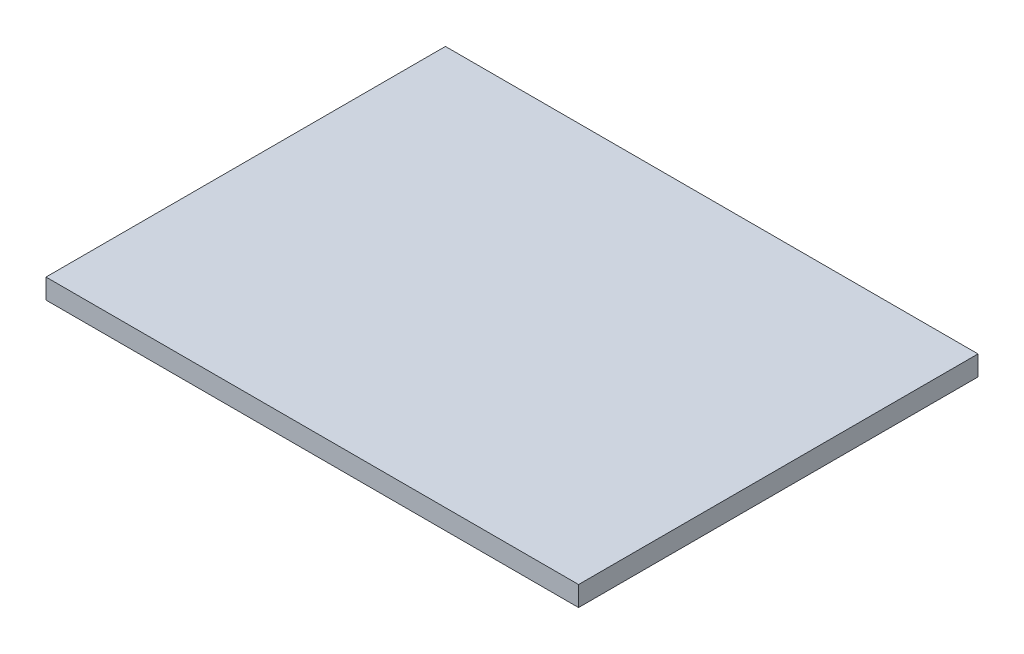
ISO-10303-21;
HEADER;
FILE_DESCRIPTION(('STEP AP214'),'2;1');
FILE_NAME('part.step','',(''),(''),'','','');
FILE_SCHEMA(('AUTOMOTIVE_DESIGN { 1 0 10303 214 1 1 1 1 }'));
ENDSEC;
DATA;
#1=APPLICATION_CONTEXT('core data for automotive mechanical design processes');
#2=APPLICATION_PROTOCOL_DEFINITION('international standard','automotive_design',2000,#1);
#3=PRODUCT_CONTEXT('',#1,'mechanical');
#4=PRODUCT('Part','Part','',(#3));
#5=PRODUCT_RELATED_PRODUCT_CATEGORY('part','',(#4));
#6=PRODUCT_DEFINITION_FORMATION('','',#4);
#7=PRODUCT_DEFINITION_CONTEXT('part definition',#1,'design');
#8=PRODUCT_DEFINITION('design','',#6,#7);
#9=PRODUCT_DEFINITION_SHAPE('','',#8);
#10=(LENGTH_UNIT() NAMED_UNIT(*) SI_UNIT(.MILLI.,.METRE.));
#11=(NAMED_UNIT(*) PLANE_ANGLE_UNIT() SI_UNIT($,.RADIAN.));
#12=(NAMED_UNIT(*) SI_UNIT($,.STERADIAN.) SOLID_ANGLE_UNIT());
#13=UNCERTAINTY_MEASURE_WITH_UNIT(LENGTH_MEASURE(1.E-05),#10,'distance_accuracy_value','');
#14=(GEOMETRIC_REPRESENTATION_CONTEXT(3) GLOBAL_UNCERTAINTY_ASSIGNED_CONTEXT((#13)) GLOBAL_UNIT_ASSIGNED_CONTEXT((#10,
#11,#12)) REPRESENTATION_CONTEXT('',''));
#15=CARTESIAN_POINT('',(0.,0.,0.));
#16=DIRECTION('',(0.,0.,1.));
#17=DIRECTION('',(1.,0.,0.));
#18=AXIS2_PLACEMENT_3D('',#15,#16,#17);
#19=CARTESIAN_POINT('',(40.,3.,-30.));
#20=DIRECTION('',(-1.,0.,0.));
#21=DIRECTION('',(0.,0.,1.));
#22=AXIS2_PLACEMENT_3D('',#19,#20,#21);
#23=PLANE('',#22);
#24=DIRECTION('',(0.,0.,-1.));
#25=VECTOR('',#24,1.);
#26=CARTESIAN_POINT('',(40.,0.,-30.));
#27=LINE('',#26,#25);
#28=CARTESIAN_POINT('',(40.,0.,30.));
#29=VERTEX_POINT('',#28);
#30=CARTESIAN_POINT('',(40.,0.,-30.));
#31=VERTEX_POINT('',#30);
#32=EDGE_CURVE('E107',#29,#31,#27,.T.);
#33=ORIENTED_EDGE('',*,*,#32,.T.);
#34=DIRECTION('',(0.,-1.,0.));
#35=VECTOR('',#34,1.);
#36=CARTESIAN_POINT('',(40.,3.,-30.));
#37=LINE('',#36,#35);
#38=CARTESIAN_POINT('',(40.,3.,-30.));
#39=VERTEX_POINT('',#38);
#40=EDGE_CURVE('E11',#39,#31,#37,.T.);
#41=ORIENTED_EDGE('',*,*,#40,.F.);
#42=DIRECTION('',(0.,0.,-1.));
#43=VECTOR('',#42,1.);
#44=CARTESIAN_POINT('',(40.,3.,-30.));
#45=LINE('',#44,#43);
#46=CARTESIAN_POINT('',(40.,3.,30.));
#47=VERTEX_POINT('',#46);
#48=EDGE_CURVE('E91',#47,#39,#45,.T.);
#49=ORIENTED_EDGE('',*,*,#48,.F.);
#50=DIRECTION('',(0.,-1.,0.));
#51=VECTOR('',#50,1.);
#52=CARTESIAN_POINT('',(40.,3.,30.));
#53=LINE('',#52,#51);
#54=EDGE_CURVE('E103',#47,#29,#53,.T.);
#55=ORIENTED_EDGE('',*,*,#54,.T.);
#56=EDGE_LOOP('',(#33,#41,#49,#55));
#57=FACE_BOUND('',#56,.T.);
#58=ADVANCED_FACE('F39',(#57),#23,.F.);
#59=CARTESIAN_POINT('',(-40.,3.,-30.));
#60=DIRECTION('',(0.,0.,1.));
#61=DIRECTION('',(1.,0.,0.));
#62=AXIS2_PLACEMENT_3D('',#59,#60,#61);
#63=PLANE('',#62);
#64=DIRECTION('',(-1.,0.,0.));
#65=VECTOR('',#64,1.);
#66=CARTESIAN_POINT('',(-40.,0.,-30.));
#67=LINE('',#66,#65);
#68=CARTESIAN_POINT('',(-40.,0.,-30.));
#69=VERTEX_POINT('',#68);
#70=EDGE_CURVE('E96',#31,#69,#67,.T.);
#71=ORIENTED_EDGE('',*,*,#70,.T.);
#72=DIRECTION('',(0.,-1.,0.));
#73=VECTOR('',#72,1.);
#74=CARTESIAN_POINT('',(-40.,3.,-30.));
#75=LINE('',#74,#73);
#76=CARTESIAN_POINT('',(-40.,3.,-30.));
#77=VERTEX_POINT('',#76);
#78=EDGE_CURVE('E48',#77,#69,#75,.T.);
#79=ORIENTED_EDGE('',*,*,#78,.F.);
#80=DIRECTION('',(-1.,0.,0.));
#81=VECTOR('',#80,1.);
#82=CARTESIAN_POINT('',(-40.,3.,-30.));
#83=LINE('',#82,#81);
#84=EDGE_CURVE('E86',#39,#77,#83,.T.);
#85=ORIENTED_EDGE('',*,*,#84,.F.);
#86=ORIENTED_EDGE('',*,*,#40,.T.);
#87=EDGE_LOOP('',(#71,#79,#85,#86));
#88=FACE_BOUND('',#87,.T.);
#89=ADVANCED_FACE('F95',(#88),#63,.F.);
#90=CARTESIAN_POINT('',(-40.,3.,-30.));
#91=DIRECTION('',(1.,0.,0.));
#92=DIRECTION('',(0.,0.,-1.));
#93=AXIS2_PLACEMENT_3D('',#90,#91,#92);
#94=PLANE('',#93);
#95=DIRECTION('',(0.,0.,1.));
#96=VECTOR('',#95,1.);
#97=CARTESIAN_POINT('',(-40.,0.,-30.));
#98=LINE('',#97,#96);
#99=CARTESIAN_POINT('',(-40.,0.,30.));
#100=VERTEX_POINT('',#99);
#101=EDGE_CURVE('E73',#69,#100,#98,.T.);
#102=ORIENTED_EDGE('',*,*,#101,.T.);
#103=DIRECTION('',(0.,-1.,0.));
#104=VECTOR('',#103,1.);
#105=CARTESIAN_POINT('',(-40.,3.,30.));
#106=LINE('',#105,#104);
#107=CARTESIAN_POINT('',(-40.,3.,30.));
#108=VERTEX_POINT('',#107);
#109=EDGE_CURVE('E98',#108,#100,#106,.T.);
#110=ORIENTED_EDGE('',*,*,#109,.F.);
#111=DIRECTION('',(0.,0.,1.));
#112=VECTOR('',#111,1.);
#113=CARTESIAN_POINT('',(-40.,3.,-30.));
#114=LINE('',#113,#112);
#115=EDGE_CURVE('E89',#77,#108,#114,.T.);
#116=ORIENTED_EDGE('',*,*,#115,.F.);
#117=ORIENTED_EDGE('',*,*,#78,.T.);
#118=EDGE_LOOP('',(#102,#110,#116,#117));
#119=FACE_BOUND('',#118,.T.);
#120=ADVANCED_FACE('F99',(#119),#94,.F.);
#121=CARTESIAN_POINT('',(-40.,3.,30.));
#122=DIRECTION('',(0.,0.,-1.));
#123=DIRECTION('',(-1.,0.,0.));
#124=AXIS2_PLACEMENT_3D('',#121,#122,#123);
#125=PLANE('',#124);
#126=DIRECTION('',(1.,0.,0.));
#127=VECTOR('',#126,1.);
#128=CARTESIAN_POINT('',(-40.,0.,30.));
#129=LINE('',#128,#127);
#130=EDGE_CURVE('E79',#100,#29,#129,.T.);
#131=ORIENTED_EDGE('',*,*,#130,.T.);
#132=ORIENTED_EDGE('',*,*,#54,.F.);
#133=DIRECTION('',(1.,0.,0.));
#134=VECTOR('',#133,1.);
#135=CARTESIAN_POINT('',(-40.,3.,30.));
#136=LINE('',#135,#134);
#137=EDGE_CURVE('E56',#108,#47,#136,.T.);
#138=ORIENTED_EDGE('',*,*,#137,.F.);
#139=ORIENTED_EDGE('',*,*,#109,.T.);
#140=EDGE_LOOP('',(#131,#132,#138,#139));
#141=FACE_BOUND('',#140,.T.);
#142=ADVANCED_FACE('F120',(#141),#125,.F.);
#143=CARTESIAN_POINT('',(0.,3.,0.));
#144=DIRECTION('',(0.,1.,0.));
#145=DIRECTION('',(0.,0.,1.));
#146=AXIS2_PLACEMENT_3D('',#143,#144,#145);
#147=PLANE('',#146);
#148=ORIENTED_EDGE('',*,*,#48,.T.);
#149=ORIENTED_EDGE('',*,*,#84,.T.);
#150=ORIENTED_EDGE('',*,*,#115,.T.);
#151=ORIENTED_EDGE('',*,*,#137,.T.);
#152=EDGE_LOOP('',(#148,#149,#150,#151));
#153=FACE_BOUND('',#152,.T.);
#154=ADVANCED_FACE('F87',(#153),#147,.T.);
#155=CARTESIAN_POINT('',(0.,0.,0.));
#156=DIRECTION('',(0.,1.,0.));
#157=DIRECTION('',(0.,0.,1.));
#158=AXIS2_PLACEMENT_3D('',#155,#156,#157);
#159=PLANE('',#158);
#160=ORIENTED_EDGE('',*,*,#32,.F.);
#161=ORIENTED_EDGE('',*,*,#130,.F.);
#162=ORIENTED_EDGE('',*,*,#101,.F.);
#163=ORIENTED_EDGE('',*,*,#70,.F.);
#164=EDGE_LOOP('',(#160,#161,#162,#163));
#165=FACE_BOUND('',#164,.T.);
#166=ADVANCED_FACE('F123',(#165),#159,.F.);
#167=CLOSED_SHELL('',(#58,#89,#120,#142,#154,#166));
#168=MANIFOLD_SOLID_BREP('B2',#167);
#169=ADVANCED_BREP_SHAPE_REPRESENTATION('',(#18,#168),#14);
#170=SHAPE_DEFINITION_REPRESENTATION(#9,#169);
ENDSEC;
END-ISO-10303-21;
